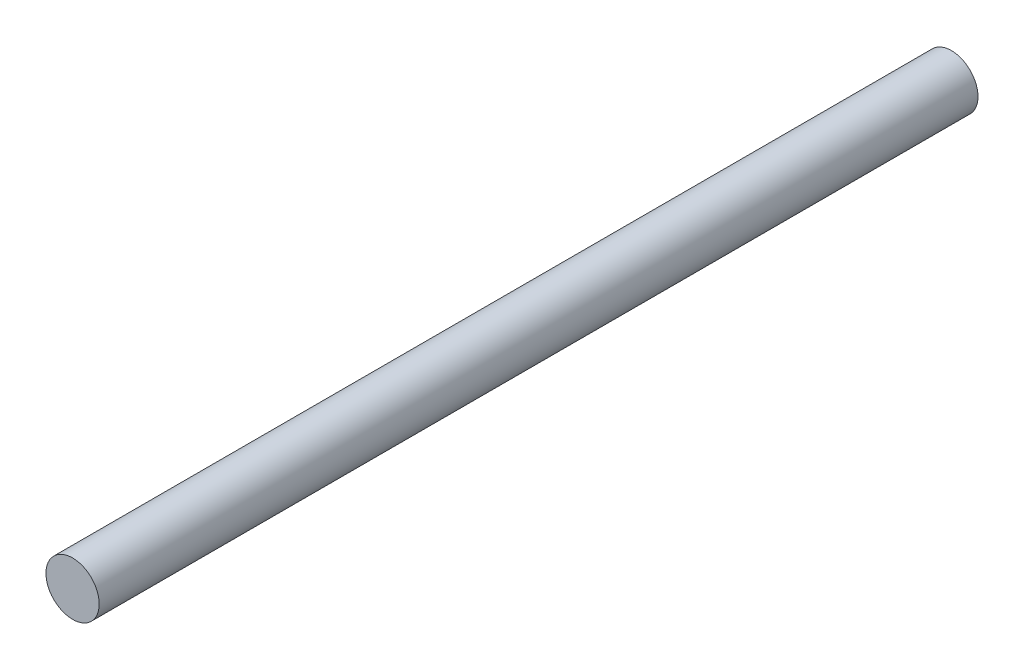
ISO-10303-21;
HEADER;
FILE_DESCRIPTION(('STEP AP214'),'2;1');
FILE_NAME('part.step','',(''),(''),'','','');
FILE_SCHEMA(('AUTOMOTIVE_DESIGN { 1 0 10303 214 1 1 1 1 }'));
ENDSEC;
DATA;
#1=APPLICATION_CONTEXT('core data for automotive mechanical design processes');
#2=APPLICATION_PROTOCOL_DEFINITION('international standard','automotive_design',2000,#1);
#3=PRODUCT_CONTEXT('',#1,'mechanical');
#4=PRODUCT('Part','Part','',(#3));
#5=PRODUCT_RELATED_PRODUCT_CATEGORY('part','',(#4));
#6=PRODUCT_DEFINITION_FORMATION('','',#4);
#7=PRODUCT_DEFINITION_CONTEXT('part definition',#1,'design');
#8=PRODUCT_DEFINITION('design','',#6,#7);
#9=PRODUCT_DEFINITION_SHAPE('','',#8);
#10=(LENGTH_UNIT() NAMED_UNIT(*) SI_UNIT(.MILLI.,.METRE.));
#11=(NAMED_UNIT(*) PLANE_ANGLE_UNIT() SI_UNIT($,.RADIAN.));
#12=(NAMED_UNIT(*) SI_UNIT($,.STERADIAN.) SOLID_ANGLE_UNIT());
#13=UNCERTAINTY_MEASURE_WITH_UNIT(LENGTH_MEASURE(1.E-05),#10,'distance_accuracy_value','');
#14=(GEOMETRIC_REPRESENTATION_CONTEXT(3) GLOBAL_UNCERTAINTY_ASSIGNED_CONTEXT((#13)) GLOBAL_UNIT_ASSIGNED_CONTEXT((#10,
#11,#12)) REPRESENTATION_CONTEXT('',''));
#15=CARTESIAN_POINT('',(0.,0.,0.));
#16=DIRECTION('',(0.,0.,1.));
#17=DIRECTION('',(1.,0.,0.));
#18=AXIS2_PLACEMENT_3D('',#15,#16,#17);
#19=CARTESIAN_POINT('',(0.,0.,66.));
#20=DIRECTION('',(0.,0.,-1.));
#21=DIRECTION('',(-1.,0.,0.));
#22=AXIS2_PLACEMENT_3D('',#19,#20,#21);
#23=CYLINDRICAL_SURFACE('',#22,2.);
#24=CARTESIAN_POINT('',(0.,0.,66.));
#25=DIRECTION('',(0.,0.,1.));
#26=DIRECTION('',(1.,0.,0.));
#27=AXIS2_PLACEMENT_3D('',#24,#25,#26);
#28=CIRCLE('',#27,2.);
#29=CARTESIAN_POINT('',(2.,0.,66.));
#30=VERTEX_POINT('',#29);
#31=EDGE_CURVE('E10',#30,#30,#28,.T.);
#32=ORIENTED_EDGE('',*,*,#31,.F.);
#33=EDGE_LOOP('',(#32));
#34=FACE_BOUND('',#33,.T.);
#35=CARTESIAN_POINT('',(0.,0.,0.));
#36=DIRECTION('',(0.,0.,1.));
#37=DIRECTION('',(1.,0.,0.));
#38=AXIS2_PLACEMENT_3D('',#35,#36,#37);
#39=CIRCLE('',#38,2.);
#40=CARTESIAN_POINT('',(2.,0.,0.));
#41=VERTEX_POINT('',#40);
#42=EDGE_CURVE('E39',#41,#41,#39,.T.);
#43=ORIENTED_EDGE('',*,*,#42,.T.);
#44=EDGE_LOOP('',(#43));
#45=FACE_BOUND('',#44,.T.);
#46=ADVANCED_FACE('F36',(#34,#45),#23,.T.);
#47=CARTESIAN_POINT('',(0.,0.,66.));
#48=DIRECTION('',(0.,0.,1.));
#49=DIRECTION('',(1.,0.,0.));
#50=AXIS2_PLACEMENT_3D('',#47,#48,#49);
#51=PLANE('',#50);
#52=ORIENTED_EDGE('',*,*,#31,.T.);
#53=EDGE_LOOP('',(#52));
#54=FACE_BOUND('',#53,.T.);
#55=ADVANCED_FACE('F51',(#54),#51,.T.);
#56=CARTESIAN_POINT('',(0.,0.,0.));
#57=DIRECTION('',(0.,0.,1.));
#58=DIRECTION('',(1.,0.,0.));
#59=AXIS2_PLACEMENT_3D('',#56,#57,#58);
#60=PLANE('',#59);
#61=ORIENTED_EDGE('',*,*,#42,.F.);
#62=EDGE_LOOP('',(#61));
#63=FACE_BOUND('',#62,.T.);
#64=ADVANCED_FACE('F49',(#63),#60,.F.);
#65=CLOSED_SHELL('',(#46,#55,#64));
#66=MANIFOLD_SOLID_BREP('B2',#65);
#67=ADVANCED_BREP_SHAPE_REPRESENTATION('',(#18,#66),#14);
#68=SHAPE_DEFINITION_REPRESENTATION(#9,#67);
ENDSEC;
END-ISO-10303-21;
